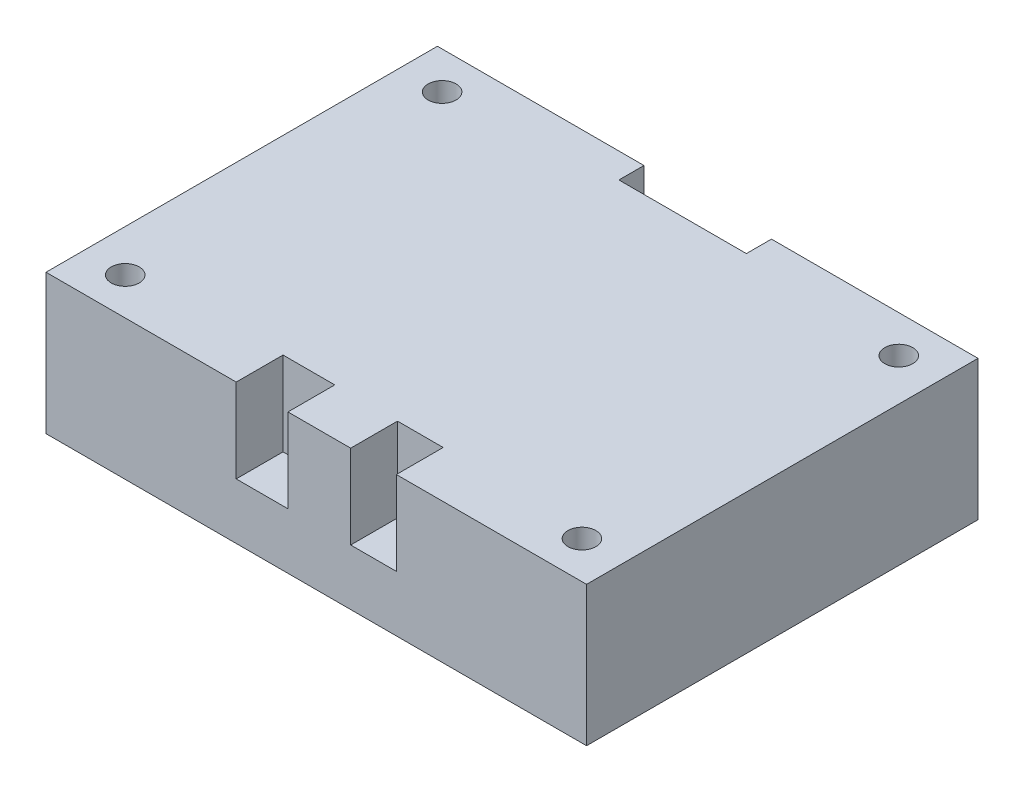
ISO-10303-21;
HEADER;
FILE_DESCRIPTION(('STEP AP214'),'2;1');
FILE_NAME('part.step','',(''),(''),'','','');
FILE_SCHEMA(('AUTOMOTIVE_DESIGN { 1 0 10303 214 1 1 1 1 }'));
ENDSEC;
DATA;
#1=APPLICATION_CONTEXT('core data for automotive mechanical design processes');
#2=APPLICATION_PROTOCOL_DEFINITION('international standard','automotive_design',2000,#1);
#3=PRODUCT_CONTEXT('',#1,'mechanical');
#4=PRODUCT('Part','Part','',(#3));
#5=PRODUCT_RELATED_PRODUCT_CATEGORY('part','',(#4));
#6=PRODUCT_DEFINITION_FORMATION('','',#4);
#7=PRODUCT_DEFINITION_CONTEXT('part definition',#1,'design');
#8=PRODUCT_DEFINITION('design','',#6,#7);
#9=PRODUCT_DEFINITION_SHAPE('','',#8);
#10=(LENGTH_UNIT() NAMED_UNIT(*) SI_UNIT(.MILLI.,.METRE.));
#11=(NAMED_UNIT(*) PLANE_ANGLE_UNIT() SI_UNIT($,.RADIAN.));
#12=(NAMED_UNIT(*) SI_UNIT($,.STERADIAN.) SOLID_ANGLE_UNIT());
#13=UNCERTAINTY_MEASURE_WITH_UNIT(LENGTH_MEASURE(1.E-05),#10,'distance_accuracy_value','');
#14=(GEOMETRIC_REPRESENTATION_CONTEXT(3) GLOBAL_UNCERTAINTY_ASSIGNED_CONTEXT((#13)) GLOBAL_UNIT_ASSIGNED_CONTEXT((#10,
#11,#12)) REPRESENTATION_CONTEXT('',''));
#15=CARTESIAN_POINT('',(0.,0.,0.));
#16=DIRECTION('',(0.,0.,1.));
#17=DIRECTION('',(1.,0.,0.));
#18=AXIS2_PLACEMENT_3D('',#15,#16,#17);
#19=CARTESIAN_POINT('',(0.,6.00000000000001,0.));
#20=DIRECTION('',(0.,1.,0.));
#21=DIRECTION('',(0.,0.,1.));
#22=AXIS2_PLACEMENT_3D('',#19,#20,#21);
#23=PLANE('',#22);
#24=DIRECTION('',(1.,0.,0.));
#25=VECTOR('',#24,1.);
#26=CARTESIAN_POINT('',(-29.,6.00000000000001,21.));
#27=LINE('',#26,#25);
#28=CARTESIAN_POINT('',(-8.59127397187303,6.00000000000001,21.));
#29=VERTEX_POINT('',#28);
#30=CARTESIAN_POINT('',(-3.03932053886473,6.00000000000001,21.));
#31=VERTEX_POINT('',#30);
#32=EDGE_CURVE('E64',#29,#31,#27,.T.);
#33=ORIENTED_EDGE('',*,*,#32,.T.);
#34=DIRECTION('',(0.,0.,1.));
#35=VECTOR('',#34,1.);
#36=CARTESIAN_POINT('',(-3.03932053886473,6.00000000000001,15.9759468036468));
#37=LINE('',#36,#35);
#38=CARTESIAN_POINT('',(-3.03932053886473,6.00000000000001,15.9759468036468));
#39=VERTEX_POINT('',#38);
#40=EDGE_CURVE('E180',#39,#31,#37,.T.);
#41=ORIENTED_EDGE('',*,*,#40,.F.);
#42=DIRECTION('',(-1.,0.,0.));
#43=VECTOR('',#42,1.);
#44=CARTESIAN_POINT('',(-8.59127397187304,6.00000000000001,15.9759468036468));
#45=LINE('',#44,#43);
#46=CARTESIAN_POINT('',(-8.59127397187304,6.00000000000001,15.9759468036468));
#47=VERTEX_POINT('',#46);
#48=EDGE_CURVE('E190',#39,#47,#45,.T.);
#49=ORIENTED_EDGE('',*,*,#48,.T.);
#50=DIRECTION('',(0.,0.,1.));
#51=VECTOR('',#50,1.);
#52=CARTESIAN_POINT('',(-8.59127397187304,6.00000000000001,15.9759468036468));
#53=LINE('',#52,#51);
#54=EDGE_CURVE('E194',#47,#29,#53,.T.);
#55=ORIENTED_EDGE('',*,*,#54,.T.);
#56=EDGE_LOOP('',(#33,#41,#49,#55));
#57=FACE_BOUND('',#56,.T.);
#58=ADVANCED_FACE('F41',(#57),#23,.T.);
#59=CARTESIAN_POINT('',(8.59127397187304,6.00000000000001,15.9759468036468));
#60=VERTEX_POINT('',#59);
#61=CARTESIAN_POINT('',(3.69060351147859,6.00000000000001,15.9759468036468));
#62=VERTEX_POINT('',#61);
#63=EDGE_CURVE('E192',#60,#62,#45,.T.);
#64=ORIENTED_EDGE('',*,*,#63,.T.);
#65=DIRECTION('',(0.,0.,-1.));
#66=VECTOR('',#65,1.);
#67=CARTESIAN_POINT('',(3.69060351147859,6.00000000000001,15.9759468036468));
#68=LINE('',#67,#66);
#69=CARTESIAN_POINT('',(3.69060351147859,6.00000000000001,21.));
#70=VERTEX_POINT('',#69);
#71=EDGE_CURVE('E56',#70,#62,#68,.T.);
#72=ORIENTED_EDGE('',*,*,#71,.F.);
#73=CARTESIAN_POINT('',(8.59127397187304,6.00000000000001,21.));
#74=VERTEX_POINT('',#73);
#75=EDGE_CURVE('E290',#70,#74,#27,.T.);
#76=ORIENTED_EDGE('',*,*,#75,.T.);
#77=DIRECTION('',(0.,0.,-1.));
#78=VECTOR('',#77,1.);
#79=CARTESIAN_POINT('',(8.59127397187304,6.00000000000001,15.9759468036468));
#80=LINE('',#79,#78);
#81=EDGE_CURVE('E188',#74,#60,#80,.T.);
#82=ORIENTED_EDGE('',*,*,#81,.T.);
#83=EDGE_LOOP('',(#64,#72,#76,#82));
#84=FACE_BOUND('',#83,.T.);
#85=ADVANCED_FACE('F322',(#84),#23,.T.);
#86=CARTESIAN_POINT('',(-8.59127397187304,6.00000000000001,15.9759468036468));
#87=DIRECTION('',(0.,0.,-1.));
#88=DIRECTION('',(-1.,0.,0.));
#89=AXIS2_PLACEMENT_3D('',#86,#87,#88);
#90=PLANE('',#89);
#91=DIRECTION('',(0.,-1.,0.));
#92=VECTOR('',#91,1.);
#93=CARTESIAN_POINT('',(-3.03932053886473,15.,15.9759468036468));
#94=LINE('',#93,#92);
#95=CARTESIAN_POINT('',(-3.03932053886473,15.,15.9759468036468));
#96=VERTEX_POINT('',#95);
#97=EDGE_CURVE('E329',#96,#39,#94,.T.);
#98=ORIENTED_EDGE('',*,*,#97,.F.);
#99=DIRECTION('',(-1.,0.,0.));
#100=VECTOR('',#99,1.);
#101=CARTESIAN_POINT('',(-8.59127397187304,15.,15.9759468036468));
#102=LINE('',#101,#100);
#103=CARTESIAN_POINT('',(-8.59127397187304,15.,15.9759468036468));
#104=VERTEX_POINT('',#103);
#105=EDGE_CURVE('E174',#96,#104,#102,.T.);
#106=ORIENTED_EDGE('',*,*,#105,.T.);
#107=DIRECTION('',(0.,1.,0.));
#108=VECTOR('',#107,1.);
#109=CARTESIAN_POINT('',(-8.59127397187304,6.00000000000001,15.9759468036468));
#110=LINE('',#109,#108);
#111=EDGE_CURVE('E200',#47,#104,#110,.T.);
#112=ORIENTED_EDGE('',*,*,#111,.F.);
#113=ORIENTED_EDGE('',*,*,#48,.F.);
#114=EDGE_LOOP('',(#98,#106,#112,#113));
#115=FACE_BOUND('',#114,.T.);
#116=ADVANCED_FACE('F332',(#115),#90,.F.);
#117=DIRECTION('',(0.,-1.,0.));
#118=VECTOR('',#117,1.);
#119=CARTESIAN_POINT('',(3.69060351147859,15.,15.9759468036468));
#120=LINE('',#119,#118);
#121=CARTESIAN_POINT('',(3.69060351147859,15.,15.9759468036468));
#122=VERTEX_POINT('',#121);
#123=EDGE_CURVE('E184',#122,#62,#120,.T.);
#124=ORIENTED_EDGE('',*,*,#123,.T.);
#125=ORIENTED_EDGE('',*,*,#63,.F.);
#126=DIRECTION('',(0.,1.,0.));
#127=VECTOR('',#126,1.);
#128=CARTESIAN_POINT('',(8.59127397187304,6.00000000000001,15.9759468036468));
#129=LINE('',#128,#127);
#130=CARTESIAN_POINT('',(8.59127397187304,15.,15.9759468036468));
#131=VERTEX_POINT('',#130);
#132=EDGE_CURVE('E195',#60,#131,#129,.T.);
#133=ORIENTED_EDGE('',*,*,#132,.T.);
#134=EDGE_CURVE('E197',#131,#122,#102,.T.);
#135=ORIENTED_EDGE('',*,*,#134,.T.);
#136=EDGE_LOOP('',(#124,#125,#133,#135));
#137=FACE_BOUND('',#136,.T.);
#138=ADVANCED_FACE('F320',(#137),#90,.F.);
#139=CARTESIAN_POINT('',(0.,15.,0.));
#140=DIRECTION('',(0.,1.,0.));
#141=DIRECTION('',(0.,0.,1.));
#142=AXIS2_PLACEMENT_3D('',#139,#140,#141);
#143=PLANE('',#142);
#144=DIRECTION('',(0.,0.,-1.));
#145=VECTOR('',#144,1.);
#146=CARTESIAN_POINT('',(8.59127397187304,15.,15.9759468036468));
#147=LINE('',#146,#145);
#148=CARTESIAN_POINT('',(8.59127397187304,15.,21.));
#149=VERTEX_POINT('',#148);
#150=EDGE_CURVE('E181',#149,#131,#147,.T.);
#151=ORIENTED_EDGE('',*,*,#150,.F.);
#152=DIRECTION('',(1.,0.,0.));
#153=VECTOR('',#152,1.);
#154=CARTESIAN_POINT('',(-29.,15.,21.));
#155=LINE('',#154,#153);
#156=CARTESIAN_POINT('',(29.,15.,21.));
#157=VERTEX_POINT('',#156);
#158=EDGE_CURVE('E259',#149,#157,#155,.T.);
#159=ORIENTED_EDGE('',*,*,#158,.T.);
#160=DIRECTION('',(0.,0.,-1.));
#161=VECTOR('',#160,1.);
#162=CARTESIAN_POINT('',(29.,15.,-21.));
#163=LINE('',#162,#161);
#164=CARTESIAN_POINT('',(29.,15.,-21.));
#165=VERTEX_POINT('',#164);
#166=EDGE_CURVE('E249',#157,#165,#163,.T.);
#167=ORIENTED_EDGE('',*,*,#166,.T.);
#168=DIRECTION('',(-1.,0.,0.));
#169=VECTOR('',#168,1.);
#170=CARTESIAN_POINT('',(-29.,15.,-21.));
#171=LINE('',#170,#169);
#172=CARTESIAN_POINT('',(6.83965500673387,15.,-21.));
#173=VERTEX_POINT('',#172);
#174=EDGE_CURVE('E254',#165,#173,#171,.T.);
#175=ORIENTED_EDGE('',*,*,#174,.T.);
#176=DIRECTION('',(0.,0.,-1.));
#177=VECTOR('',#176,1.);
#178=CARTESIAN_POINT('',(6.83965500673387,15.,-23.6908682377138));
#179=LINE('',#178,#177);
#180=CARTESIAN_POINT('',(6.83965500673387,15.,-18.3091317622862));
#181=VERTEX_POINT('',#180);
#182=EDGE_CURVE('E203',#181,#173,#179,.T.);
#183=ORIENTED_EDGE('',*,*,#182,.F.);
#184=DIRECTION('',(1.,0.,0.));
#185=VECTOR('',#184,1.);
#186=CARTESIAN_POINT('',(-6.83965500673386,15.,-18.3091317622862));
#187=LINE('',#186,#185);
#188=CARTESIAN_POINT('',(-6.83965500673386,15.,-18.3091317622862));
#189=VERTEX_POINT('',#188);
#190=EDGE_CURVE('E209',#189,#181,#187,.T.);
#191=ORIENTED_EDGE('',*,*,#190,.F.);
#192=DIRECTION('',(0.,0.,1.));
#193=VECTOR('',#192,1.);
#194=CARTESIAN_POINT('',(-6.83965500673386,15.,-23.6908682377138));
#195=LINE('',#194,#193);
#196=CARTESIAN_POINT('',(-6.83965500673386,15.,-21.));
#197=VERTEX_POINT('',#196);
#198=EDGE_CURVE('E216',#197,#189,#195,.T.);
#199=ORIENTED_EDGE('',*,*,#198,.F.);
#200=CARTESIAN_POINT('',(-29.,15.,-21.));
#201=VERTEX_POINT('',#200);
#202=EDGE_CURVE('E252',#197,#201,#171,.T.);
#203=ORIENTED_EDGE('',*,*,#202,.T.);
#204=DIRECTION('',(0.,0.,1.));
#205=VECTOR('',#204,1.);
#206=CARTESIAN_POINT('',(-29.,15.,-21.));
#207=LINE('',#206,#205);
#208=CARTESIAN_POINT('',(-29.,15.,21.));
#209=VERTEX_POINT('',#208);
#210=EDGE_CURVE('E257',#201,#209,#207,.T.);
#211=ORIENTED_EDGE('',*,*,#210,.T.);
#212=CARTESIAN_POINT('',(-8.59127397187304,15.,21.));
#213=VERTEX_POINT('',#212);
#214=EDGE_CURVE('E260',#209,#213,#155,.T.);
#215=ORIENTED_EDGE('',*,*,#214,.T.);
#216=DIRECTION('',(0.,0.,1.));
#217=VECTOR('',#216,1.);
#218=CARTESIAN_POINT('',(-8.59127397187304,15.,15.9759468036468));
#219=LINE('',#218,#217);
#220=EDGE_CURVE('E191',#104,#213,#219,.T.);
#221=ORIENTED_EDGE('',*,*,#220,.F.);
#222=ORIENTED_EDGE('',*,*,#105,.F.);
#223=DIRECTION('',(0.,0.,1.));
#224=VECTOR('',#223,1.);
#225=CARTESIAN_POINT('',(-3.03932053886473,15.,15.9759468036468));
#226=LINE('',#225,#224);
#227=CARTESIAN_POINT('',(-3.03932053886473,15.,21.));
#228=VERTEX_POINT('',#227);
#229=EDGE_CURVE('E167',#96,#228,#226,.T.);
#230=ORIENTED_EDGE('',*,*,#229,.T.);
#231=DIRECTION('',(1.,0.,0.));
#232=VECTOR('',#231,1.);
#233=CARTESIAN_POINT('',(-3.03932053886473,15.,21.));
#234=LINE('',#233,#232);
#235=CARTESIAN_POINT('',(3.69060351147859,15.,21.));
#236=VERTEX_POINT('',#235);
#237=EDGE_CURVE('E154',#228,#236,#234,.T.);
#238=ORIENTED_EDGE('',*,*,#237,.T.);
#239=DIRECTION('',(0.,0.,-1.));
#240=VECTOR('',#239,1.);
#241=CARTESIAN_POINT('',(3.69060351147859,15.,15.9759468036468));
#242=LINE('',#241,#240);
#243=EDGE_CURVE('E166',#236,#122,#242,.T.);
#244=ORIENTED_EDGE('',*,*,#243,.T.);
#245=ORIENTED_EDGE('',*,*,#134,.F.);
#246=EDGE_LOOP('',(#151,#159,#167,#175,#183,#191,#199,#203,#211,#215,#221,#222,#230,#238,#244,#245));
#247=FACE_BOUND('',#246,.T.);
#248=CARTESIAN_POINT('',(24.5,15.,17.));
#249=DIRECTION('',(0.,1.,0.));
#250=DIRECTION('',(0.,0.,1.));
#251=AXIS2_PLACEMENT_3D('',#248,#249,#250);
#252=CIRCLE('',#251,1.5);
#253=CARTESIAN_POINT('',(24.5,15.,18.5));
#254=VERTEX_POINT('',#253);
#255=EDGE_CURVE('E231',#254,#254,#252,.T.);
#256=ORIENTED_EDGE('',*,*,#255,.F.);
#257=EDGE_LOOP('',(#256));
#258=FACE_BOUND('',#257,.T.);
#259=CARTESIAN_POINT('',(-24.5,15.,-17.));
#260=DIRECTION('',(0.,1.,0.));
#261=DIRECTION('',(0.,0.,1.));
#262=AXIS2_PLACEMENT_3D('',#259,#260,#261);
#263=CIRCLE('',#262,1.5);
#264=CARTESIAN_POINT('',(-24.5,15.,-15.5));
#265=VERTEX_POINT('',#264);
#266=EDGE_CURVE('E243',#265,#265,#263,.T.);
#267=ORIENTED_EDGE('',*,*,#266,.F.);
#268=EDGE_LOOP('',(#267));
#269=FACE_BOUND('',#268,.T.);
#270=CARTESIAN_POINT('',(-24.5,15.,17.));
#271=DIRECTION('',(0.,1.,0.));
#272=DIRECTION('',(0.,0.,-1.));
#273=AXIS2_PLACEMENT_3D('',#270,#271,#272);
#274=CIRCLE('',#273,1.5);
#275=CARTESIAN_POINT('',(-24.5,15.,15.5));
#276=VERTEX_POINT('',#275);
#277=EDGE_CURVE('E237',#276,#276,#274,.T.);
#278=ORIENTED_EDGE('',*,*,#277,.F.);
#279=EDGE_LOOP('',(#278));
#280=FACE_BOUND('',#279,.T.);
#281=CARTESIAN_POINT('',(24.5,15.,-17.));
#282=DIRECTION('',(0.,1.,0.));
#283=DIRECTION('',(0.,0.,-1.));
#284=AXIS2_PLACEMENT_3D('',#281,#282,#283);
#285=CIRCLE('',#284,1.5);
#286=CARTESIAN_POINT('',(24.5,15.,-18.5));
#287=VERTEX_POINT('',#286);
#288=EDGE_CURVE('E225',#287,#287,#285,.T.);
#289=ORIENTED_EDGE('',*,*,#288,.F.);
#290=EDGE_LOOP('',(#289));
#291=FACE_BOUND('',#290,.T.);
#292=ADVANCED_FACE('F171',(#247,#258,#269,#280,#291),#143,.T.);
#293=CARTESIAN_POINT('',(0.,0.,0.));
#294=DIRECTION('',(0.,1.,0.));
#295=DIRECTION('',(0.,0.,1.));
#296=AXIS2_PLACEMENT_3D('',#293,#294,#295);
#297=PLANE('',#296);
#298=DIRECTION('',(0.,0.,-1.));
#299=VECTOR('',#298,1.);
#300=CARTESIAN_POINT('',(29.,0.,-21.));
#301=LINE('',#300,#299);
#302=CARTESIAN_POINT('',(29.,0.,21.));
#303=VERTEX_POINT('',#302);
#304=CARTESIAN_POINT('',(29.,0.,-21.));
#305=VERTEX_POINT('',#304);
#306=EDGE_CURVE('E246',#303,#305,#301,.T.);
#307=ORIENTED_EDGE('',*,*,#306,.F.);
#308=DIRECTION('',(1.,0.,0.));
#309=VECTOR('',#308,1.);
#310=CARTESIAN_POINT('',(-29.,0.,21.));
#311=LINE('',#310,#309);
#312=CARTESIAN_POINT('',(-29.,0.,21.));
#313=VERTEX_POINT('',#312);
#314=EDGE_CURVE('E253',#313,#303,#311,.T.);
#315=ORIENTED_EDGE('',*,*,#314,.F.);
#316=DIRECTION('',(0.,0.,1.));
#317=VECTOR('',#316,1.);
#318=CARTESIAN_POINT('',(-29.,0.,-21.));
#319=LINE('',#318,#317);
#320=CARTESIAN_POINT('',(-29.,0.,-21.));
#321=VERTEX_POINT('',#320);
#322=EDGE_CURVE('E268',#321,#313,#319,.T.);
#323=ORIENTED_EDGE('',*,*,#322,.F.);
#324=DIRECTION('',(-1.,0.,0.));
#325=VECTOR('',#324,1.);
#326=CARTESIAN_POINT('',(-29.,0.,-21.));
#327=LINE('',#326,#325);
#328=EDGE_CURVE('E266',#305,#321,#327,.T.);
#329=ORIENTED_EDGE('',*,*,#328,.F.);
#330=EDGE_LOOP('',(#307,#315,#323,#329));
#331=FACE_BOUND('',#330,.T.);
#332=CARTESIAN_POINT('',(-24.5,0.,-17.));
#333=DIRECTION('',(0.,1.,0.));
#334=DIRECTION('',(0.,0.,1.));
#335=AXIS2_PLACEMENT_3D('',#332,#333,#334);
#336=CIRCLE('',#335,1.5);
#337=CARTESIAN_POINT('',(-24.5,0.,-15.5));
#338=VERTEX_POINT('',#337);
#339=EDGE_CURVE('E240',#338,#338,#336,.T.);
#340=ORIENTED_EDGE('',*,*,#339,.T.);
#341=EDGE_LOOP('',(#340));
#342=FACE_BOUND('',#341,.T.);
#343=CARTESIAN_POINT('',(-24.5,0.,17.));
#344=DIRECTION('',(0.,1.,0.));
#345=DIRECTION('',(0.,0.,-1.));
#346=AXIS2_PLACEMENT_3D('',#343,#344,#345);
#347=CIRCLE('',#346,1.5);
#348=CARTESIAN_POINT('',(-24.5,0.,15.5));
#349=VERTEX_POINT('',#348);
#350=EDGE_CURVE('E234',#349,#349,#347,.T.);
#351=ORIENTED_EDGE('',*,*,#350,.T.);
#352=EDGE_LOOP('',(#351));
#353=FACE_BOUND('',#352,.T.);
#354=CARTESIAN_POINT('',(24.5,0.,17.));
#355=DIRECTION('',(0.,1.,0.));
#356=DIRECTION('',(0.,0.,1.));
#357=AXIS2_PLACEMENT_3D('',#354,#355,#356);
#358=CIRCLE('',#357,1.5);
#359=CARTESIAN_POINT('',(24.5,0.,18.5));
#360=VERTEX_POINT('',#359);
#361=EDGE_CURVE('E228',#360,#360,#358,.T.);
#362=ORIENTED_EDGE('',*,*,#361,.T.);
#363=EDGE_LOOP('',(#362));
#364=FACE_BOUND('',#363,.T.);
#365=CARTESIAN_POINT('',(24.5,0.,-17.));
#366=DIRECTION('',(0.,1.,0.));
#367=DIRECTION('',(0.,0.,-1.));
#368=AXIS2_PLACEMENT_3D('',#365,#366,#367);
#369=CIRCLE('',#368,1.5);
#370=CARTESIAN_POINT('',(24.5,0.,-18.5));
#371=VERTEX_POINT('',#370);
#372=EDGE_CURVE('E222',#371,#371,#369,.T.);
#373=ORIENTED_EDGE('',*,*,#372,.T.);
#374=EDGE_LOOP('',(#373));
#375=FACE_BOUND('',#374,.T.);
#376=ADVANCED_FACE('F308',(#331,#342,#353,#364,#375),#297,.F.);
#377=CARTESIAN_POINT('',(29.,15.,-21.));
#378=DIRECTION('',(-1.,0.,0.));
#379=DIRECTION('',(0.,0.,1.));
#380=AXIS2_PLACEMENT_3D('',#377,#378,#379);
#381=PLANE('',#380);
#382=ORIENTED_EDGE('',*,*,#306,.T.);
#383=DIRECTION('',(0.,-1.,0.));
#384=VECTOR('',#383,1.);
#385=CARTESIAN_POINT('',(29.,15.,-21.));
#386=LINE('',#385,#384);
#387=EDGE_CURVE('E279',#165,#305,#386,.T.);
#388=ORIENTED_EDGE('',*,*,#387,.F.);
#389=ORIENTED_EDGE('',*,*,#166,.F.);
#390=DIRECTION('',(0.,-1.,0.));
#391=VECTOR('',#390,1.);
#392=CARTESIAN_POINT('',(29.,15.,21.));
#393=LINE('',#392,#391);
#394=EDGE_CURVE('E263',#157,#303,#393,.T.);
#395=ORIENTED_EDGE('',*,*,#394,.T.);
#396=EDGE_LOOP('',(#382,#388,#389,#395));
#397=FACE_BOUND('',#396,.T.);
#398=ADVANCED_FACE('F43',(#397),#381,.F.);
#399=CARTESIAN_POINT('',(-29.,15.,-21.));
#400=DIRECTION('',(0.,0.,1.));
#401=DIRECTION('',(1.,0.,0.));
#402=AXIS2_PLACEMENT_3D('',#399,#400,#401);
#403=PLANE('',#402);
#404=DIRECTION('',(-1.,0.,0.));
#405=VECTOR('',#404,1.);
#406=CARTESIAN_POINT('',(-29.,3.,-21.));
#407=LINE('',#406,#405);
#408=CARTESIAN_POINT('',(6.83965500673387,3.,-21.));
#409=VERTEX_POINT('',#408);
#410=CARTESIAN_POINT('',(-6.83965500673386,3.,-21.));
#411=VERTEX_POINT('',#410);
#412=EDGE_CURVE('E282',#409,#411,#407,.T.);
#413=ORIENTED_EDGE('',*,*,#412,.F.);
#414=DIRECTION('',(0.,1.,0.));
#415=VECTOR('',#414,1.);
#416=CARTESIAN_POINT('',(6.83965500673387,15.,-21.));
#417=LINE('',#416,#415);
#418=EDGE_CURVE('E287',#409,#173,#417,.T.);
#419=ORIENTED_EDGE('',*,*,#418,.T.);
#420=ORIENTED_EDGE('',*,*,#174,.F.);
#421=ORIENTED_EDGE('',*,*,#387,.T.);
#422=ORIENTED_EDGE('',*,*,#328,.T.);
#423=DIRECTION('',(0.,-1.,0.));
#424=VECTOR('',#423,1.);
#425=CARTESIAN_POINT('',(-29.,15.,-21.));
#426=LINE('',#425,#424);
#427=EDGE_CURVE('E276',#201,#321,#426,.T.);
#428=ORIENTED_EDGE('',*,*,#427,.F.);
#429=ORIENTED_EDGE('',*,*,#202,.F.);
#430=DIRECTION('',(0.,-1.,0.));
#431=VECTOR('',#430,1.);
#432=CARTESIAN_POINT('',(-6.83965500673386,15.,-21.));
#433=LINE('',#432,#431);
#434=EDGE_CURVE('E284',#197,#411,#433,.T.);
#435=ORIENTED_EDGE('',*,*,#434,.T.);
#436=EDGE_LOOP('',(#413,#419,#420,#421,#422,#428,#429,#435));
#437=FACE_BOUND('',#436,.T.);
#438=ADVANCED_FACE('F502',(#437),#403,.F.);
#439=CARTESIAN_POINT('',(-29.,15.,-21.));
#440=DIRECTION('',(1.,0.,0.));
#441=DIRECTION('',(0.,0.,-1.));
#442=AXIS2_PLACEMENT_3D('',#439,#440,#441);
#443=PLANE('',#442);
#444=ORIENTED_EDGE('',*,*,#322,.T.);
#445=DIRECTION('',(0.,-1.,0.));
#446=VECTOR('',#445,1.);
#447=CARTESIAN_POINT('',(-29.,15.,21.));
#448=LINE('',#447,#446);
#449=EDGE_CURVE('E273',#209,#313,#448,.T.);
#450=ORIENTED_EDGE('',*,*,#449,.F.);
#451=ORIENTED_EDGE('',*,*,#210,.F.);
#452=ORIENTED_EDGE('',*,*,#427,.T.);
#453=EDGE_LOOP('',(#444,#450,#451,#452));
#454=FACE_BOUND('',#453,.T.);
#455=ADVANCED_FACE('F302',(#454),#443,.F.);
#456=CARTESIAN_POINT('',(-29.,15.,21.));
#457=DIRECTION('',(0.,0.,-1.));
#458=DIRECTION('',(-1.,0.,0.));
#459=AXIS2_PLACEMENT_3D('',#456,#457,#458);
#460=PLANE('',#459);
#461=ORIENTED_EDGE('',*,*,#158,.F.);
#462=DIRECTION('',(0.,-1.,0.));
#463=VECTOR('',#462,1.);
#464=CARTESIAN_POINT('',(8.59127397187305,15.,21.));
#465=LINE('',#464,#463);
#466=EDGE_CURVE('E11',#149,#74,#465,.T.);
#467=ORIENTED_EDGE('',*,*,#466,.T.);
#468=ORIENTED_EDGE('',*,*,#75,.F.);
#469=DIRECTION('',(0.,-1.,0.));
#470=VECTOR('',#469,1.);
#471=CARTESIAN_POINT('',(3.69060351147859,15.,21.));
#472=LINE('',#471,#470);
#473=EDGE_CURVE('E162',#236,#70,#472,.T.);
#474=ORIENTED_EDGE('',*,*,#473,.F.);
#475=ORIENTED_EDGE('',*,*,#237,.F.);
#476=DIRECTION('',(0.,-1.,0.));
#477=VECTOR('',#476,1.);
#478=CARTESIAN_POINT('',(-3.03932053886473,15.,21.));
#479=LINE('',#478,#477);
#480=EDGE_CURVE('E159',#228,#31,#479,.T.);
#481=ORIENTED_EDGE('',*,*,#480,.T.);
#482=ORIENTED_EDGE('',*,*,#32,.F.);
#483=DIRECTION('',(0.,1.,0.));
#484=VECTOR('',#483,1.);
#485=CARTESIAN_POINT('',(-8.59127397187304,15.,21.));
#486=LINE('',#485,#484);
#487=EDGE_CURVE('E49',#29,#213,#486,.T.);
#488=ORIENTED_EDGE('',*,*,#487,.T.);
#489=ORIENTED_EDGE('',*,*,#214,.F.);
#490=ORIENTED_EDGE('',*,*,#449,.T.);
#491=ORIENTED_EDGE('',*,*,#314,.T.);
#492=ORIENTED_EDGE('',*,*,#394,.F.);
#493=EDGE_LOOP('',(#461,#467,#468,#474,#475,#481,#482,#488,#489,#490,#491,#492));
#494=FACE_BOUND('',#493,.T.);
#495=ADVANCED_FACE('F157',(#494),#460,.F.);
#496=CARTESIAN_POINT('',(-24.5,15.,-17.));
#497=DIRECTION('',(0.,-1.,0.));
#498=DIRECTION('',(0.,0.,-1.));
#499=AXIS2_PLACEMENT_3D('',#496,#497,#498);
#500=CYLINDRICAL_SURFACE('',#499,1.5);
#501=ORIENTED_EDGE('',*,*,#266,.T.);
#502=EDGE_LOOP('',(#501));
#503=FACE_BOUND('',#502,.T.);
#504=ORIENTED_EDGE('',*,*,#339,.F.);
#505=EDGE_LOOP('',(#504));
#506=FACE_BOUND('',#505,.T.);
#507=ADVANCED_FACE('F366',(#503,#506),#500,.F.);
#508=CARTESIAN_POINT('',(-24.5,15.,17.));
#509=DIRECTION('',(0.,-1.,0.));
#510=DIRECTION('',(0.,0.,-1.));
#511=AXIS2_PLACEMENT_3D('',#508,#509,#510);
#512=CYLINDRICAL_SURFACE('',#511,1.5);
#513=ORIENTED_EDGE('',*,*,#277,.T.);
#514=EDGE_LOOP('',(#513));
#515=FACE_BOUND('',#514,.T.);
#516=ORIENTED_EDGE('',*,*,#350,.F.);
#517=EDGE_LOOP('',(#516));
#518=FACE_BOUND('',#517,.T.);
#519=ADVANCED_FACE('F470',(#515,#518),#512,.F.);
#520=CARTESIAN_POINT('',(24.5,15.,17.));
#521=DIRECTION('',(0.,-1.,0.));
#522=DIRECTION('',(0.,0.,-1.));
#523=AXIS2_PLACEMENT_3D('',#520,#521,#522);
#524=CYLINDRICAL_SURFACE('',#523,1.5);
#525=ORIENTED_EDGE('',*,*,#255,.T.);
#526=EDGE_LOOP('',(#525));
#527=FACE_BOUND('',#526,.T.);
#528=ORIENTED_EDGE('',*,*,#361,.F.);
#529=EDGE_LOOP('',(#528));
#530=FACE_BOUND('',#529,.T.);
#531=ADVANCED_FACE('F460',(#527,#530),#524,.F.);
#532=CARTESIAN_POINT('',(24.5,15.,-17.));
#533=DIRECTION('',(0.,-1.,0.));
#534=DIRECTION('',(0.,0.,-1.));
#535=AXIS2_PLACEMENT_3D('',#532,#533,#534);
#536=CYLINDRICAL_SURFACE('',#535,1.5);
#537=ORIENTED_EDGE('',*,*,#288,.T.);
#538=EDGE_LOOP('',(#537));
#539=FACE_BOUND('',#538,.T.);
#540=ORIENTED_EDGE('',*,*,#372,.F.);
#541=EDGE_LOOP('',(#540));
#542=FACE_BOUND('',#541,.T.);
#543=ADVANCED_FACE('F449',(#539,#542),#536,.F.);
#544=CARTESIAN_POINT('',(6.83965500673387,3.,-23.6908682377138));
#545=DIRECTION('',(1.,0.,0.));
#546=DIRECTION('',(0.,0.,-1.));
#547=AXIS2_PLACEMENT_3D('',#544,#545,#546);
#548=PLANE('',#547);
#549=DIRECTION('',(0.,0.,-1.));
#550=VECTOR('',#549,1.);
#551=CARTESIAN_POINT('',(6.83965500673387,3.,-23.6908682377138));
#552=LINE('',#551,#550);
#553=CARTESIAN_POINT('',(6.83965500673387,3.,-18.3091317622862));
#554=VERTEX_POINT('',#553);
#555=EDGE_CURVE('E206',#554,#409,#552,.T.);
#556=ORIENTED_EDGE('',*,*,#555,.F.);
#557=DIRECTION('',(0.,1.,0.));
#558=VECTOR('',#557,1.);
#559=CARTESIAN_POINT('',(6.83965500673387,3.,-18.3091317622862));
#560=LINE('',#559,#558);
#561=EDGE_CURVE('E220',#554,#181,#560,.T.);
#562=ORIENTED_EDGE('',*,*,#561,.T.);
#563=ORIENTED_EDGE('',*,*,#182,.T.);
#564=ORIENTED_EDGE('',*,*,#418,.F.);
#565=EDGE_LOOP('',(#556,#562,#563,#564));
#566=FACE_BOUND('',#565,.T.);
#567=ADVANCED_FACE('F439',(#566),#548,.F.);
#568=CARTESIAN_POINT('',(-6.83965500673386,3.,-23.6908682377138));
#569=DIRECTION('',(-1.,0.,0.));
#570=DIRECTION('',(0.,0.,1.));
#571=AXIS2_PLACEMENT_3D('',#568,#569,#570);
#572=PLANE('',#571);
#573=ORIENTED_EDGE('',*,*,#198,.T.);
#574=DIRECTION('',(0.,1.,0.));
#575=VECTOR('',#574,1.);
#576=CARTESIAN_POINT('',(-6.83965500673386,3.,-18.3091317622862));
#577=LINE('',#576,#575);
#578=CARTESIAN_POINT('',(-6.83965500673386,3.,-18.3091317622862));
#579=VERTEX_POINT('',#578);
#580=EDGE_CURVE('E214',#579,#189,#577,.T.);
#581=ORIENTED_EDGE('',*,*,#580,.F.);
#582=DIRECTION('',(0.,0.,1.));
#583=VECTOR('',#582,1.);
#584=CARTESIAN_POINT('',(-6.83965500673386,3.,-23.6908682377138));
#585=LINE('',#584,#583);
#586=EDGE_CURVE('E208',#411,#579,#585,.T.);
#587=ORIENTED_EDGE('',*,*,#586,.F.);
#588=ORIENTED_EDGE('',*,*,#434,.F.);
#589=EDGE_LOOP('',(#573,#581,#587,#588));
#590=FACE_BOUND('',#589,.T.);
#591=ADVANCED_FACE('F429',(#590),#572,.F.);
#592=CARTESIAN_POINT('',(0.,3.,0.));
#593=DIRECTION('',(0.,1.,0.));
#594=DIRECTION('',(0.,0.,1.));
#595=AXIS2_PLACEMENT_3D('',#592,#593,#594);
#596=PLANE('',#595);
#597=ORIENTED_EDGE('',*,*,#412,.T.);
#598=ORIENTED_EDGE('',*,*,#586,.T.);
#599=DIRECTION('',(1.,0.,0.));
#600=VECTOR('',#599,1.);
#601=CARTESIAN_POINT('',(-6.83965500673386,3.,-18.3091317622862));
#602=LINE('',#601,#600);
#603=EDGE_CURVE('E211',#579,#554,#602,.T.);
#604=ORIENTED_EDGE('',*,*,#603,.T.);
#605=ORIENTED_EDGE('',*,*,#555,.T.);
#606=EDGE_LOOP('',(#597,#598,#604,#605));
#607=FACE_BOUND('',#606,.T.);
#608=ADVANCED_FACE('F419',(#607),#596,.T.);
#609=CARTESIAN_POINT('',(-6.83965500673386,3.,-18.3091317622862));
#610=DIRECTION('',(0.,0.,1.));
#611=DIRECTION('',(1.,0.,0.));
#612=AXIS2_PLACEMENT_3D('',#609,#610,#611);
#613=PLANE('',#612);
#614=ORIENTED_EDGE('',*,*,#190,.T.);
#615=ORIENTED_EDGE('',*,*,#561,.F.);
#616=ORIENTED_EDGE('',*,*,#603,.F.);
#617=ORIENTED_EDGE('',*,*,#580,.T.);
#618=EDGE_LOOP('',(#614,#615,#616,#617));
#619=FACE_BOUND('',#618,.T.);
#620=ADVANCED_FACE('F343',(#619),#613,.F.);
#621=CARTESIAN_POINT('',(8.59127397187304,6.00000000000001,15.9759468036468));
#622=DIRECTION('',(1.,0.,0.));
#623=DIRECTION('',(0.,0.,-1.));
#624=AXIS2_PLACEMENT_3D('',#621,#622,#623);
#625=PLANE('',#624);
#626=ORIENTED_EDGE('',*,*,#150,.T.);
#627=ORIENTED_EDGE('',*,*,#132,.F.);
#628=ORIENTED_EDGE('',*,*,#81,.F.);
#629=ORIENTED_EDGE('',*,*,#466,.F.);
#630=EDGE_LOOP('',(#626,#627,#628,#629));
#631=FACE_BOUND('',#630,.T.);
#632=ADVANCED_FACE('F316',(#631),#625,.F.);
#633=CARTESIAN_POINT('',(-8.59127397187304,6.00000000000001,15.9759468036468));
#634=DIRECTION('',(-1.,0.,0.));
#635=DIRECTION('',(0.,0.,1.));
#636=AXIS2_PLACEMENT_3D('',#633,#634,#635);
#637=PLANE('',#636);
#638=ORIENTED_EDGE('',*,*,#54,.F.);
#639=ORIENTED_EDGE('',*,*,#111,.T.);
#640=ORIENTED_EDGE('',*,*,#220,.T.);
#641=ORIENTED_EDGE('',*,*,#487,.F.);
#642=EDGE_LOOP('',(#638,#639,#640,#641));
#643=FACE_BOUND('',#642,.T.);
#644=ADVANCED_FACE('F334',(#643),#637,.F.);
#645=CARTESIAN_POINT('',(-3.03932053886473,15.,15.9759468036468));
#646=DIRECTION('',(1.,0.,0.));
#647=DIRECTION('',(0.,0.,-1.));
#648=AXIS2_PLACEMENT_3D('',#645,#646,#647);
#649=PLANE('',#648);
#650=ORIENTED_EDGE('',*,*,#40,.T.);
#651=ORIENTED_EDGE('',*,*,#480,.F.);
#652=ORIENTED_EDGE('',*,*,#229,.F.);
#653=ORIENTED_EDGE('',*,*,#97,.T.);
#654=EDGE_LOOP('',(#650,#651,#652,#653));
#655=FACE_BOUND('',#654,.T.);
#656=ADVANCED_FACE('F179',(#655),#649,.F.);
#657=CARTESIAN_POINT('',(3.69060351147859,15.,15.9759468036468));
#658=DIRECTION('',(-1.,0.,0.));
#659=DIRECTION('',(0.,0.,1.));
#660=AXIS2_PLACEMENT_3D('',#657,#658,#659);
#661=PLANE('',#660);
#662=ORIENTED_EDGE('',*,*,#71,.T.);
#663=ORIENTED_EDGE('',*,*,#123,.F.);
#664=ORIENTED_EDGE('',*,*,#243,.F.);
#665=ORIENTED_EDGE('',*,*,#473,.T.);
#666=EDGE_LOOP('',(#662,#663,#664,#665));
#667=FACE_BOUND('',#666,.T.);
#668=ADVANCED_FACE('F324',(#667),#661,.F.);
#669=CLOSED_SHELL('',(#58,#85,#116,#138,#292,#376,#398,#438,#455,#495,#507,#519,#531,#543,#567,
#591,#608,#620,#632,#644,#656,#668));
#670=MANIFOLD_SOLID_BREP('B2',#669);
#671=ADVANCED_BREP_SHAPE_REPRESENTATION('',(#18,#670),#14);
#672=SHAPE_DEFINITION_REPRESENTATION(#9,#671);
ENDSEC;
END-ISO-10303-21;
